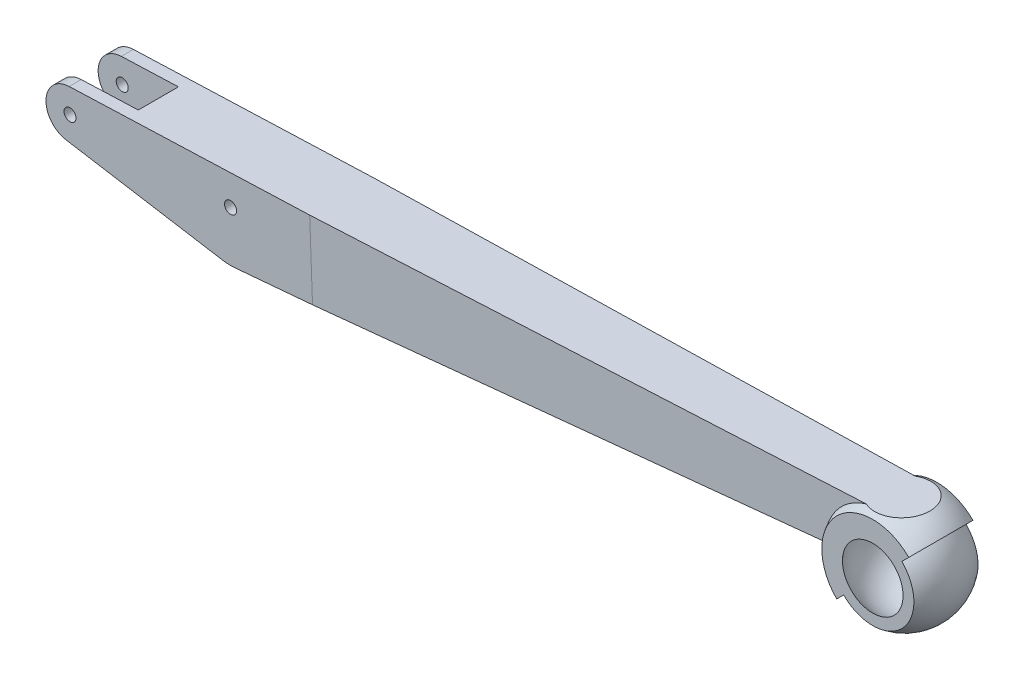
ISO-10303-21;
HEADER;
FILE_DESCRIPTION(('STEP AP214'),'2;1');
FILE_NAME('part.step','',(''),(''),'','','');
FILE_SCHEMA(('AUTOMOTIVE_DESIGN { 1 0 10303 214 1 1 1 1 }'));
ENDSEC;
DATA;
#1=APPLICATION_CONTEXT('core data for automotive mechanical design processes');
#2=APPLICATION_PROTOCOL_DEFINITION('international standard','automotive_design',2000,#1);
#3=PRODUCT_CONTEXT('',#1,'mechanical');
#4=PRODUCT('Part','Part','',(#3));
#5=PRODUCT_RELATED_PRODUCT_CATEGORY('part','',(#4));
#6=PRODUCT_DEFINITION_FORMATION('','',#4);
#7=PRODUCT_DEFINITION_CONTEXT('part definition',#1,'design');
#8=PRODUCT_DEFINITION('design','',#6,#7);
#9=PRODUCT_DEFINITION_SHAPE('','',#8);
#10=(LENGTH_UNIT() NAMED_UNIT(*) SI_UNIT(.MILLI.,.METRE.));
#11=(NAMED_UNIT(*) PLANE_ANGLE_UNIT() SI_UNIT($,.RADIAN.));
#12=(NAMED_UNIT(*) SI_UNIT($,.STERADIAN.) SOLID_ANGLE_UNIT());
#13=UNCERTAINTY_MEASURE_WITH_UNIT(LENGTH_MEASURE(1.E-05),#10,'distance_accuracy_value','');
#14=(GEOMETRIC_REPRESENTATION_CONTEXT(3) GLOBAL_UNCERTAINTY_ASSIGNED_CONTEXT((#13)) GLOBAL_UNIT_ASSIGNED_CONTEXT((#10,
#11,#12)) REPRESENTATION_CONTEXT('',''));
#15=CARTESIAN_POINT('',(0.,0.,0.));
#16=DIRECTION('',(0.,0.,1.));
#17=DIRECTION('',(1.,0.,0.));
#18=AXIS2_PLACEMENT_3D('',#15,#16,#17);
#19=CARTESIAN_POINT('',(0.,0.,-8.));
#20=DIRECTION('',(0.,0.,1.));
#21=DIRECTION('',(-1.,0.,0.));
#22=AXIS2_PLACEMENT_3D('',#19,#20,#21);
#23=CYLINDRICAL_SURFACE('',#22,12.5269384468381);
#24=CARTESIAN_POINT('',(0.,0.,5.));
#25=DIRECTION('',(0.,0.,1.));
#26=DIRECTION('',(1.,0.,0.));
#27=AXIS2_PLACEMENT_3D('',#24,#25,#26);
#28=CIRCLE('',#27,12.5269384468381);
#29=CARTESIAN_POINT('',(-2.04406390424603,-12.3590448500775,5.));
#30=VERTEX_POINT('',#29);
#31=CARTESIAN_POINT('',(1.08223577138531,-12.4801022666484,5.));
#32=VERTEX_POINT('',#31);
#33=EDGE_CURVE('E247',#30,#32,#28,.T.);
#34=ORIENTED_EDGE('',*,*,#33,.T.);
#35=DIRECTION('',(0.,0.,1.));
#36=VECTOR('',#35,1.);
#37=CARTESIAN_POINT('',(1.08223577138531,-12.4801022666484,-8.));
#38=LINE('',#37,#36);
#39=CARTESIAN_POINT('',(1.08223577138531,-12.4801022666484,8.));
#40=VERTEX_POINT('',#39);
#41=EDGE_CURVE('E369',#32,#40,#38,.T.);
#42=ORIENTED_EDGE('',*,*,#41,.T.);
#43=CARTESIAN_POINT('',(0.,0.,8.));
#44=DIRECTION('',(0.,0.,1.));
#45=DIRECTION('',(1.,0.,0.));
#46=AXIS2_PLACEMENT_3D('',#43,#44,#45);
#47=CIRCLE('',#46,12.5269384468381);
#48=CARTESIAN_POINT('',(-2.04406390424603,-12.3590448500775,8.));
#49=VERTEX_POINT('',#48);
#50=EDGE_CURVE('E330',#49,#40,#47,.T.);
#51=ORIENTED_EDGE('',*,*,#50,.F.);
#52=DIRECTION('',(0.,0.,1.));
#53=VECTOR('',#52,1.);
#54=CARTESIAN_POINT('',(-2.04406390424603,-12.3590448500775,-8.));
#55=LINE('',#54,#53);
#56=EDGE_CURVE('E346',#30,#49,#55,.T.);
#57=ORIENTED_EDGE('',*,*,#56,.F.);
#58=EDGE_LOOP('',(#34,#42,#51,#57));
#59=FACE_BOUND('',#58,.T.);
#60=ADVANCED_FACE('F35',(#59),#23,.T.);
#61=CARTESIAN_POINT('',(160.,0.,0.));
#62=DIRECTION('',(-1.,0.,0.));
#63=DIRECTION('',(0.,1.,0.));
#64=AXIS2_PLACEMENT_3D('',#61,#62,#63);
#65=SPHERICAL_SURFACE('',#64,15.);
#66=CARTESIAN_POINT('',(159.505151467158,13.3817007512717,0.));
#67=DIRECTION('',(-0.0369542362489187,0.999316958939084,0.));
#68=DIRECTION('',(0.999316958939084,0.0369542362489187,0.));
#69=AXIS2_PLACEMENT_3D('',#66,#67,#68);
#70=CIRCLE('',#69,6.75908351279662);
#71=CARTESIAN_POINT('',(156.493436870342,13.2703290671133,-6.04999020397985));
#72=VERTEX_POINT('',#71);
#73=CARTESIAN_POINT('',(156.493436870342,13.2703290671133,6.04999020397985));
#74=VERTEX_POINT('',#73);
#75=EDGE_CURVE('E380',#72,#74,#70,.F.);
#76=ORIENTED_EDGE('',*,*,#75,.T.);
#77=CARTESIAN_POINT('',(160.08550336549,0.00316187125628183,6.00583569941776));
#78=DIRECTION('',(0.0142352695206122,0.000526413074676742,0.999898534847887));
#79=DIRECTION('',(0.999898673389219,0.,-0.0142352714929856));
#80=AXIS2_PLACEMENT_3D('',#77,#78,#79);
#81=CIRCLE('',#80,13.744912394361);
#82=CARTESIAN_POINT('',(146.342449375036,0.116413047256877,6.20143200631746));
#83=VERTEX_POINT('',#82);
#84=EDGE_CURVE('E317',#74,#83,#81,.T.);
#85=ORIENTED_EDGE('',*,*,#84,.T.);
#86=CARTESIAN_POINT('',(159.888044575374,1.29104506206708,0.));
#87=DIRECTION('',(0.0863926789437108,-0.996261163061639,0.));
#88=DIRECTION('',(-0.996261163061639,-0.0863926789437108,0.));
#89=AXIS2_PLACEMENT_3D('',#86,#87,#88);
#90=CIRCLE('',#89,14.9439174459246);
#91=CARTESIAN_POINT('',(146.342449375036,0.116413047256878,-6.20143200631746));
#92=VERTEX_POINT('',#91);
#93=EDGE_CURVE('E314',#83,#92,#90,.T.);
#94=ORIENTED_EDGE('',*,*,#93,.T.);
#95=CARTESIAN_POINT('',(160.08550336549,0.00316187125628183,-6.00583569941776));
#96=DIRECTION('',(0.0142352695206122,0.000526413074676742,-0.999898534847887));
#97=DIRECTION('',(-0.999898673389219,0.,-0.0142352714929856));
#98=AXIS2_PLACEMENT_3D('',#95,#96,#97);
#99=CIRCLE('',#98,13.744912394361);
#100=EDGE_CURVE('E377',#92,#72,#99,.T.);
#101=ORIENTED_EDGE('',*,*,#100,.T.);
#102=EDGE_LOOP('',(#76,#85,#94,#101));
#103=FACE_BOUND('',#102,.T.);
#104=CARTESIAN_POINT('',(160.,0.,8.));
#105=DIRECTION('',(0.,0.,1.));
#106=DIRECTION('',(1.,0.,0.));
#107=AXIS2_PLACEMENT_3D('',#104,#105,#106);
#108=CIRCLE('',#107,12.6885775404495);
#109=CARTESIAN_POINT('',(151.027820777537,-8.97217922246309,7.99999999999999));
#110=VERTEX_POINT('',#109);
#111=CARTESIAN_POINT('',(168.972179222463,8.97217922246318,7.99999999999999));
#112=VERTEX_POINT('',#111);
#113=EDGE_CURVE('E299',#110,#112,#108,.F.);
#114=ORIENTED_EDGE('',*,*,#113,.T.);
#115=CARTESIAN_POINT('',(160.,0.,0.));
#116=DIRECTION('',(0.707106781186549,-0.707106781186546,0.));
#117=DIRECTION('',(-0.707106781186546,-0.707106781186549,0.));
#118=AXIS2_PLACEMENT_3D('',#115,#116,#117);
#119=CIRCLE('',#118,15.);
#120=CARTESIAN_POINT('',(168.972179222463,8.97217922246319,-8.));
#121=VERTEX_POINT('',#120);
#122=EDGE_CURVE('E272',#121,#112,#119,.T.);
#123=ORIENTED_EDGE('',*,*,#122,.F.);
#124=CARTESIAN_POINT('',(160.,0.,-8.));
#125=DIRECTION('',(0.,0.,-1.));
#126=DIRECTION('',(-1.,0.,0.));
#127=AXIS2_PLACEMENT_3D('',#124,#125,#126);
#128=CIRCLE('',#127,12.6885775404495);
#129=CARTESIAN_POINT('',(151.027820777537,-8.97217922246309,-7.99999999999999));
#130=VERTEX_POINT('',#129);
#131=EDGE_CURVE('E293',#121,#130,#128,.F.);
#132=ORIENTED_EDGE('',*,*,#131,.T.);
#133=CARTESIAN_POINT('',(160.,0.,0.));
#134=DIRECTION('',(-0.707106781186544,0.707106781186551,0.));
#135=DIRECTION('',(0.707106781186551,0.707106781186544,0.));
#136=AXIS2_PLACEMENT_3D('',#133,#134,#135);
#137=CIRCLE('',#136,15.);
#138=EDGE_CURVE('E281',#130,#110,#137,.T.);
#139=ORIENTED_EDGE('',*,*,#138,.T.);
#140=EDGE_LOOP('',(#114,#123,#132,#139));
#141=FACE_BOUND('',#140,.T.);
#142=ADVANCED_FACE('F456',(#103,#141),#65,.T.);
#143=CARTESIAN_POINT('',(130.,-15.,8.));
#144=DIRECTION('',(0.,0.,-1.));
#145=DIRECTION('',(1.,0.,0.));
#146=AXIS2_PLACEMENT_3D('',#143,#144,#145);
#147=PLANE('',#146);
#148=CARTESIAN_POINT('',(160.,0.,8.));
#149=DIRECTION('',(0.,0.,1.));
#150=DIRECTION('',(1.,0.,0.));
#151=AXIS2_PLACEMENT_3D('',#148,#149,#150);
#152=CIRCLE('',#151,7.54983443527072);
#153=CARTESIAN_POINT('',(165.338539126016,5.33853912601566,8.));
#154=VERTEX_POINT('',#153);
#155=EDGE_CURVE('E266',#154,#154,#152,.F.);
#156=ORIENTED_EDGE('',*,*,#155,.T.);
#157=EDGE_LOOP('',(#156));
#158=FACE_BOUND('',#157,.T.);
#159=DIRECTION('',(0.707106781186552,0.707106781186543,0.));
#160=VECTOR('',#159,1.);
#161=CARTESIAN_POINT('',(151.027820777537,-8.97217922246309,7.99999999999999));
#162=LINE('',#161,#160);
#163=CARTESIAN_POINT('',(152.754311626905,-7.24568837309467,7.99999999999998));
#164=VERTEX_POINT('',#163);
#165=EDGE_CURVE('E284',#110,#164,#162,.T.);
#166=ORIENTED_EDGE('',*,*,#165,.T.);
#167=CARTESIAN_POINT('',(160.,0.,7.99999999999999));
#168=DIRECTION('',(0.,0.,1.));
#169=DIRECTION('',(1.,0.,0.));
#170=AXIS2_PLACEMENT_3D('',#167,#168,#169);
#171=CIRCLE('',#170,10.2469507659596);
#172=CARTESIAN_POINT('',(167.245688373095,7.24568837309475,7.99999999999998));
#173=VERTEX_POINT('',#172);
#174=EDGE_CURVE('E287',#164,#173,#171,.T.);
#175=ORIENTED_EDGE('',*,*,#174,.T.);
#176=DIRECTION('',(-0.707106781186548,-0.707106781186548,0.));
#177=VECTOR('',#176,1.);
#178=CARTESIAN_POINT('',(168.972179222463,8.97217922246318,7.99999999999999));
#179=LINE('',#178,#177);
#180=EDGE_CURVE('E274',#112,#173,#179,.T.);
#181=ORIENTED_EDGE('',*,*,#180,.F.);
#182=ORIENTED_EDGE('',*,*,#113,.F.);
#183=EDGE_LOOP('',(#166,#175,#181,#182));
#184=FACE_BOUND('',#183,.T.);
#185=ADVANCED_FACE('F489',(#158,#184),#147,.F.);
#186=CARTESIAN_POINT('',(130.,-15.,-8.));
#187=DIRECTION('',(0.,0.,1.));
#188=DIRECTION('',(-1.,0.,0.));
#189=AXIS2_PLACEMENT_3D('',#186,#187,#188);
#190=PLANE('',#189);
#191=CARTESIAN_POINT('',(160.,0.,-8.));
#192=DIRECTION('',(0.,0.,-1.));
#193=DIRECTION('',(-1.,0.,0.));
#194=AXIS2_PLACEMENT_3D('',#191,#192,#193);
#195=CIRCLE('',#194,7.54983443527072);
#196=CARTESIAN_POINT('',(165.338539126016,5.33853912601566,-8.));
#197=VERTEX_POINT('',#196);
#198=EDGE_CURVE('E265',#197,#197,#195,.F.);
#199=ORIENTED_EDGE('',*,*,#198,.T.);
#200=EDGE_LOOP('',(#199));
#201=FACE_BOUND('',#200,.T.);
#202=DIRECTION('',(-0.70710678118655,-0.707106781186545,0.));
#203=VECTOR('',#202,1.);
#204=CARTESIAN_POINT('',(151.027820777537,-8.97217922246309,-7.99999999999999));
#205=LINE('',#204,#203);
#206=CARTESIAN_POINT('',(152.754311626905,-7.24568837309466,-7.99999999999999));
#207=VERTEX_POINT('',#206);
#208=EDGE_CURVE('E279',#207,#130,#205,.T.);
#209=ORIENTED_EDGE('',*,*,#208,.T.);
#210=ORIENTED_EDGE('',*,*,#131,.F.);
#211=DIRECTION('',(0.707106781186545,0.70710678118655,0.));
#212=VECTOR('',#211,1.);
#213=CARTESIAN_POINT('',(168.972179222463,8.97217922246318,-7.99999999999999));
#214=LINE('',#213,#212);
#215=CARTESIAN_POINT('',(167.245688373095,7.24568837309474,-7.99999999999999));
#216=VERTEX_POINT('',#215);
#217=EDGE_CURVE('E60',#216,#121,#214,.T.);
#218=ORIENTED_EDGE('',*,*,#217,.F.);
#219=CARTESIAN_POINT('',(160.,0.,-7.99999999999999));
#220=DIRECTION('',(0.,0.,1.));
#221=DIRECTION('',(1.,0.,0.));
#222=AXIS2_PLACEMENT_3D('',#219,#220,#221);
#223=CIRCLE('',#222,10.2469507659596);
#224=EDGE_CURVE('E290',#207,#216,#223,.T.);
#225=ORIENTED_EDGE('',*,*,#224,.F.);
#226=EDGE_LOOP('',(#209,#210,#218,#225));
#227=FACE_BOUND('',#226,.T.);
#228=ADVANCED_FACE('F497',(#201,#227),#190,.F.);
#229=CARTESIAN_POINT('',(-40.,0.,-8.));
#230=DIRECTION('',(0.,0.,1.));
#231=DIRECTION('',(-1.,0.,0.));
#232=AXIS2_PLACEMENT_3D('',#229,#230,#231);
#233=CYLINDRICAL_SURFACE('',#232,6.);
#234=DIRECTION('',(0.,0.,1.));
#235=VECTOR('',#234,1.);
#236=CARTESIAN_POINT('',(-40.9790407670257,-5.91958437531739,-8.));
#237=LINE('',#236,#235);
#238=CARTESIAN_POINT('',(-40.9790407670257,-5.91958437531739,4.99999999999999));
#239=VERTEX_POINT('',#238);
#240=CARTESIAN_POINT('',(-40.9790407670257,-5.91958437531739,8.));
#241=VERTEX_POINT('',#240);
#242=EDGE_CURVE('E361',#239,#241,#237,.T.);
#243=ORIENTED_EDGE('',*,*,#242,.T.);
#244=CARTESIAN_POINT('',(-40.,0.,8.));
#245=DIRECTION('',(0.,0.,1.));
#246=DIRECTION('',(1.,0.,0.));
#247=AXIS2_PLACEMENT_3D('',#244,#245,#246);
#248=CIRCLE('',#247,6.);
#249=CARTESIAN_POINT('',(-40.2217254174935,5.9959017536345,8.));
#250=VERTEX_POINT('',#249);
#251=EDGE_CURVE('E354',#250,#241,#248,.T.);
#252=ORIENTED_EDGE('',*,*,#251,.F.);
#253=DIRECTION('',(0.,0.,1.));
#254=VECTOR('',#253,1.);
#255=CARTESIAN_POINT('',(-40.2217254174935,5.9959017536345,-8.));
#256=LINE('',#255,#254);
#257=CARTESIAN_POINT('',(-40.2217254174935,5.9959017536345,4.99999999999999));
#258=VERTEX_POINT('',#257);
#259=EDGE_CURVE('E365',#258,#250,#256,.T.);
#260=ORIENTED_EDGE('',*,*,#259,.F.);
#261=CARTESIAN_POINT('',(-40.,0.,4.99999999999999));
#262=DIRECTION('',(0.,0.,-1.));
#263=DIRECTION('',(-1.,0.,0.));
#264=AXIS2_PLACEMENT_3D('',#261,#262,#263);
#265=CIRCLE('',#264,6.);
#266=EDGE_CURVE('E308',#239,#258,#265,.T.);
#267=ORIENTED_EDGE('',*,*,#266,.F.);
#268=EDGE_LOOP('',(#243,#252,#260,#267));
#269=FACE_BOUND('',#268,.T.);
#270=ADVANCED_FACE('F433',(#269),#233,.T.);
#271=CARTESIAN_POINT('',(-2.04406390424603,-12.3590448500775,-8.));
#272=VERTEX_POINT('',#271);
#273=CARTESIAN_POINT('',(-2.04406390424603,-12.3590448500775,-5.));
#274=VERTEX_POINT('',#273);
#275=EDGE_CURVE('E358',#272,#274,#55,.T.);
#276=ORIENTED_EDGE('',*,*,#275,.F.);
#277=CARTESIAN_POINT('',(0.,0.,-8.));
#278=DIRECTION('',(0.,0.,1.));
#279=DIRECTION('',(1.,0.,0.));
#280=AXIS2_PLACEMENT_3D('',#277,#278,#279);
#281=CIRCLE('',#280,12.5269384468381);
#282=CARTESIAN_POINT('',(1.08223577138531,-12.4801022666484,-8.));
#283=VERTEX_POINT('',#282);
#284=EDGE_CURVE('E331',#272,#283,#281,.T.);
#285=ORIENTED_EDGE('',*,*,#284,.T.);
#286=CARTESIAN_POINT('',(1.08223577138531,-12.4801022666484,-5.));
#287=VERTEX_POINT('',#286);
#288=EDGE_CURVE('E370',#283,#287,#38,.T.);
#289=ORIENTED_EDGE('',*,*,#288,.T.);
#290=CARTESIAN_POINT('',(0.,0.,-5.));
#291=DIRECTION('',(0.,0.,1.));
#292=DIRECTION('',(1.,0.,0.));
#293=AXIS2_PLACEMENT_3D('',#290,#291,#292);
#294=CIRCLE('',#293,12.5269384468381);
#295=EDGE_CURVE('E241',#274,#287,#294,.T.);
#296=ORIENTED_EDGE('',*,*,#295,.F.);
#297=EDGE_LOOP('',(#276,#285,#289,#296));
#298=FACE_BOUND('',#297,.T.);
#299=ADVANCED_FACE('F37',(#298),#23,.T.);
#300=CARTESIAN_POINT('',(145.,0.,-8.));
#301=DIRECTION('',(-0.0863926789437108,0.996261163061639,0.));
#302=DIRECTION('',(-0.996261163061639,-0.0863926789437108,0.));
#303=AXIS2_PLACEMENT_3D('',#300,#301,#302);
#304=PLANE('',#303);
#305=ORIENTED_EDGE('',*,*,#288,.F.);
#306=DIRECTION('',(0.996261163061639,0.0863926789437108,0.));
#307=VECTOR('',#306,1.);
#308=CARTESIAN_POINT('',(1.08223577138531,-12.4801022666484,-8.));
#309=LINE('',#308,#307);
#310=CARTESIAN_POINT('',(20.4131885576658,-10.8037819807017,-8.));
#311=VERTEX_POINT('',#310);
#312=EDGE_CURVE('E334',#283,#311,#309,.T.);
#313=ORIENTED_EDGE('',*,*,#312,.T.);
#314=DIRECTION('',(-0.996160325095163,-0.0863839345879274,-0.0142275279443665));
#315=VECTOR('',#314,1.);
#316=CARTESIAN_POINT('',(144.974780819756,-0.00218692911338649,-6.22096555136907));
#317=LINE('',#316,#315);
#318=EDGE_CURVE('E322',#92,#311,#317,.T.);
#319=ORIENTED_EDGE('',*,*,#318,.F.);
#320=ORIENTED_EDGE('',*,*,#93,.F.);
#321=DIRECTION('',(0.996160325095163,0.0863839345879274,-0.0142275279443665));
#322=VECTOR('',#321,1.);
#323=CARTESIAN_POINT('',(145.201547201554,0.0174775483793186,6.21772679054655));
#324=LINE('',#323,#322);
#325=CARTESIAN_POINT('',(20.4131885576658,-10.8037819807017,8.));
#326=VERTEX_POINT('',#325);
#327=EDGE_CURVE('E328',#326,#83,#324,.T.);
#328=ORIENTED_EDGE('',*,*,#327,.F.);
#329=DIRECTION('',(0.996261163061639,0.0863926789437108,0.));
#330=VECTOR('',#329,1.);
#331=CARTESIAN_POINT('',(145.,0.,8.));
#332=LINE('',#331,#330);
#333=EDGE_CURVE('E349',#40,#326,#332,.T.);
#334=ORIENTED_EDGE('',*,*,#333,.F.);
#335=ORIENTED_EDGE('',*,*,#41,.F.);
#336=DIRECTION('',(0.996261163061639,0.0863926789437108,0.));
#337=VECTOR('',#336,1.);
#338=CARTESIAN_POINT('',(145.,0.,5.));
#339=LINE('',#338,#337);
#340=CARTESIAN_POINT('',(20.3918737201203,-10.8056303373225,5.));
#341=VERTEX_POINT('',#340);
#342=EDGE_CURVE('E238',#32,#341,#339,.T.);
#343=ORIENTED_EDGE('',*,*,#342,.T.);
#344=DIRECTION('',(0.996160325095163,0.0863839345879274,-0.0142275279443665));
#345=VECTOR('',#344,1.);
#346=CARTESIAN_POINT('',(145.159024190363,0.0137900847003733,3.21802969347853));
#347=LINE('',#346,#345);
#348=CARTESIAN_POINT('',(143.313103636008,-0.146282422108912,3.24439380938292));
#349=VERTEX_POINT('',#348);
#350=EDGE_CURVE('E234',#341,#349,#347,.T.);
#351=ORIENTED_EDGE('',*,*,#350,.T.);
#352=CARTESIAN_POINT('',(159.888044575374,1.29104506206708,0.));
#353=DIRECTION('',(0.0863926789437108,-0.996261163061639,0.));
#354=DIRECTION('',(-0.996261163061639,-0.0863926789437108,0.));
#355=AXIS2_PLACEMENT_3D('',#352,#353,#354);
#356=CIRCLE('',#355,16.9505359393327);
#357=CARTESIAN_POINT('',(143.313103636008,-0.146282422108911,-3.24439380938292));
#358=VERTEX_POINT('',#357);
#359=EDGE_CURVE('E262',#349,#358,#356,.T.);
#360=ORIENTED_EDGE('',*,*,#359,.T.);
#361=DIRECTION('',(-0.996160325095163,-0.0863839345879274,-0.0142275279443665));
#362=VECTOR('',#361,1.);
#363=CARTESIAN_POINT('',(144.932257808565,-0.00587439279233178,-3.22126845430105));
#364=LINE('',#363,#362);
#365=CARTESIAN_POINT('',(20.3918737201203,-10.8056303373225,-5.));
#366=VERTEX_POINT('',#365);
#367=EDGE_CURVE('E225',#358,#366,#364,.T.);
#368=ORIENTED_EDGE('',*,*,#367,.T.);
#369=DIRECTION('',(0.996261163061639,0.0863926789437108,0.));
#370=VECTOR('',#369,1.);
#371=CARTESIAN_POINT('',(145.,0.,-5.));
#372=LINE('',#371,#370);
#373=EDGE_CURVE('E205',#287,#366,#372,.T.);
#374=ORIENTED_EDGE('',*,*,#373,.F.);
#375=EDGE_LOOP('',(#305,#313,#319,#320,#328,#334,#335,#343,#351,#360,#368,#374));
#376=FACE_BOUND('',#375,.T.);
#377=ADVANCED_FACE('F449',(#376),#304,.F.);
#378=CARTESIAN_POINT('',(-40.2217254174935,5.9959017536345,-8.));
#379=DIRECTION('',(0.0369542362489186,-0.999316958939084,0.));
#380=DIRECTION('',(0.999316958939084,0.0369542362489187,0.));
#381=AXIS2_PLACEMENT_3D('',#378,#379,#380);
#382=PLANE('',#381);
#383=ORIENTED_EDGE('',*,*,#259,.T.);
#384=DIRECTION('',(-0.999316958939084,-0.0369542362489186,0.));
#385=VECTOR('',#384,1.);
#386=CARTESIAN_POINT('',(-40.2217254174935,5.9959017536345,8.));
#387=LINE('',#386,#385);
#388=CARTESIAN_POINT('',(19.7099891382185,8.21214627814031,8.));
#389=VERTEX_POINT('',#388);
#390=EDGE_CURVE('E352',#389,#250,#387,.T.);
#391=ORIENTED_EDGE('',*,*,#390,.F.);
#392=DIRECTION('',(-0.999215563091836,-0.0369504866817164,0.0142449994401426));
#393=VECTOR('',#392,1.);
#394=CARTESIAN_POINT('',(-39.9818228712443,6.00477322858698,8.85097736671036));
#395=LINE('',#394,#393);
#396=EDGE_CURVE('E325',#74,#389,#395,.T.);
#397=ORIENTED_EDGE('',*,*,#396,.F.);
#398=ORIENTED_EDGE('',*,*,#75,.F.);
#399=DIRECTION('',(0.999215563091836,0.0369504866817164,0.0142449994401426));
#400=VECTOR('',#399,1.);
#401=CARTESIAN_POINT('',(-40.2095640734335,5.99635147399347,-8.85422408685515));
#402=LINE('',#401,#400);
#403=CARTESIAN_POINT('',(19.7099891382185,8.21214627814031,-8.));
#404=VERTEX_POINT('',#403);
#405=EDGE_CURVE('E320',#404,#72,#402,.T.);
#406=ORIENTED_EDGE('',*,*,#405,.F.);
#407=DIRECTION('',(-0.999316958939084,-0.0369542362489186,0.));
#408=VECTOR('',#407,1.);
#409=CARTESIAN_POINT('',(147.077854414978,12.9221455850216,-8.));
#410=LINE('',#409,#408);
#411=CARTESIAN_POINT('',(-40.2217254174935,5.9959017536345,-8.));
#412=VERTEX_POINT('',#411);
#413=EDGE_CURVE('E338',#404,#412,#410,.T.);
#414=ORIENTED_EDGE('',*,*,#413,.T.);
#415=CARTESIAN_POINT('',(-40.2217254174935,5.9959017536345,-5.));
#416=VERTEX_POINT('',#415);
#417=EDGE_CURVE('E366',#412,#416,#256,.T.);
#418=ORIENTED_EDGE('',*,*,#417,.T.);
#419=DIRECTION('',(-0.999316958939084,-0.0369542362489187,0.));
#420=VECTOR('',#419,1.);
#421=CARTESIAN_POINT('',(-40.2217254174935,5.9959017536345,-5.));
#422=LINE('',#421,#420);
#423=CARTESIAN_POINT('',(-26.,6.5218139742209,-5.));
#424=VERTEX_POINT('',#423);
#425=EDGE_CURVE('E302',#424,#416,#422,.T.);
#426=ORIENTED_EDGE('',*,*,#425,.F.);
#427=DIRECTION('',(0.,0.,-1.));
#428=VECTOR('',#427,1.);
#429=CARTESIAN_POINT('',(-26.,6.52181397422091,-8.));
#430=LINE('',#429,#428);
#431=CARTESIAN_POINT('',(-26.,6.52181397422091,4.99999999999999));
#432=VERTEX_POINT('',#431);
#433=EDGE_CURVE('E305',#432,#424,#430,.T.);
#434=ORIENTED_EDGE('',*,*,#433,.F.);
#435=DIRECTION('',(0.999316958939084,0.0369542362489187,0.));
#436=VECTOR('',#435,1.);
#437=CARTESIAN_POINT('',(-40.2217254174935,5.9959017536345,4.99999999999999));
#438=LINE('',#437,#436);
#439=EDGE_CURVE('E311',#258,#432,#438,.T.);
#440=ORIENTED_EDGE('',*,*,#439,.F.);
#441=EDGE_LOOP('',(#383,#391,#397,#398,#406,#414,#418,#426,#434,#440));
#442=FACE_BOUND('',#441,.T.);
#443=ADVANCED_FACE('F429',(#442),#382,.F.);
#444=ORIENTED_EDGE('',*,*,#417,.F.);
#445=CARTESIAN_POINT('',(-40.,0.,-8.));
#446=DIRECTION('',(0.,0.,1.));
#447=DIRECTION('',(1.,0.,0.));
#448=AXIS2_PLACEMENT_3D('',#445,#446,#447);
#449=CIRCLE('',#448,6.);
#450=CARTESIAN_POINT('',(-40.9790407670257,-5.91958437531739,-8.));
#451=VERTEX_POINT('',#450);
#452=EDGE_CURVE('E341',#412,#451,#449,.T.);
#453=ORIENTED_EDGE('',*,*,#452,.T.);
#454=CARTESIAN_POINT('',(-40.9790407670257,-5.91958437531739,-5.));
#455=VERTEX_POINT('',#454);
#456=EDGE_CURVE('E362',#451,#455,#237,.T.);
#457=ORIENTED_EDGE('',*,*,#456,.T.);
#458=CARTESIAN_POINT('',(-40.,0.,-5.));
#459=DIRECTION('',(0.,0.,1.));
#460=DIRECTION('',(1.,0.,0.));
#461=AXIS2_PLACEMENT_3D('',#458,#459,#460);
#462=CIRCLE('',#461,6.);
#463=EDGE_CURVE('E296',#416,#455,#462,.T.);
#464=ORIENTED_EDGE('',*,*,#463,.F.);
#465=EDGE_LOOP('',(#444,#453,#457,#464));
#466=FACE_BOUND('',#465,.T.);
#467=ADVANCED_FACE('F466',(#466),#233,.T.);
#468=CARTESIAN_POINT('',(-40.9790407670257,-5.91958437531739,-8.));
#469=DIRECTION('',(0.163173461170952,0.986597395886231,0.));
#470=DIRECTION('',(-0.986597395886231,0.163173461170952,0.));
#471=AXIS2_PLACEMENT_3D('',#468,#469,#470);
#472=PLANE('',#471);
#473=DIRECTION('',(0.,0.,1.));
#474=VECTOR('',#473,1.);
#475=CARTESIAN_POINT('',(-23.,-8.89314007566866,-8.));
#476=LINE('',#475,#474);
#477=CARTESIAN_POINT('',(-23.,-8.89314007566866,-5.));
#478=VERTEX_POINT('',#477);
#479=CARTESIAN_POINT('',(-23.,-8.89314007566866,5.));
#480=VERTEX_POINT('',#479);
#481=EDGE_CURVE('E210',#478,#480,#476,.T.);
#482=ORIENTED_EDGE('',*,*,#481,.T.);
#483=DIRECTION('',(0.986597395886231,-0.163173461170952,0.));
#484=VECTOR('',#483,1.);
#485=CARTESIAN_POINT('',(-40.9790407670257,-5.91958437531739,5.));
#486=LINE('',#485,#484);
#487=EDGE_CURVE('E237',#480,#30,#486,.T.);
#488=ORIENTED_EDGE('',*,*,#487,.T.);
#489=ORIENTED_EDGE('',*,*,#56,.T.);
#490=DIRECTION('',(0.986597395886231,-0.163173461170952,0.));
#491=VECTOR('',#490,1.);
#492=CARTESIAN_POINT('',(-40.9790407670257,-5.91958437531739,8.));
#493=LINE('',#492,#491);
#494=EDGE_CURVE('E335',#241,#49,#493,.T.);
#495=ORIENTED_EDGE('',*,*,#494,.F.);
#496=ORIENTED_EDGE('',*,*,#242,.F.);
#497=DIRECTION('',(-0.986597395886231,0.163173461170952,0.));
#498=VECTOR('',#497,1.);
#499=CARTESIAN_POINT('',(-40.9790407670257,-5.91958437531739,4.99999999999999));
#500=LINE('',#499,#498);
#501=CARTESIAN_POINT('',(-26.,-8.39696971726919,4.99999999999999));
#502=VERTEX_POINT('',#501);
#503=EDGE_CURVE('E11',#502,#239,#500,.T.);
#504=ORIENTED_EDGE('',*,*,#503,.F.);
#505=DIRECTION('',(0.,0.,1.));
#506=VECTOR('',#505,1.);
#507=CARTESIAN_POINT('',(-26.,-8.39696971726919,-8.));
#508=LINE('',#507,#506);
#509=CARTESIAN_POINT('',(-26.,-8.39696971726919,-5.));
#510=VERTEX_POINT('',#509);
#511=EDGE_CURVE('E44',#510,#502,#508,.T.);
#512=ORIENTED_EDGE('',*,*,#511,.F.);
#513=DIRECTION('',(0.986597395886231,-0.163173461170952,0.));
#514=VECTOR('',#513,1.);
#515=CARTESIAN_POINT('',(-40.9790407670257,-5.91958437531739,-5.));
#516=LINE('',#515,#514);
#517=EDGE_CURVE('E383',#455,#510,#516,.T.);
#518=ORIENTED_EDGE('',*,*,#517,.F.);
#519=ORIENTED_EDGE('',*,*,#456,.F.);
#520=DIRECTION('',(0.986597395886231,-0.163173461170952,0.));
#521=VECTOR('',#520,1.);
#522=CARTESIAN_POINT('',(-40.9790407670257,-5.91958437531739,-8.));
#523=LINE('',#522,#521);
#524=EDGE_CURVE('E344',#451,#272,#523,.T.);
#525=ORIENTED_EDGE('',*,*,#524,.T.);
#526=ORIENTED_EDGE('',*,*,#275,.T.);
#527=DIRECTION('',(0.986597395886231,-0.163173461170952,0.));
#528=VECTOR('',#527,1.);
#529=CARTESIAN_POINT('',(-40.9790407670257,-5.91958437531739,-5.));
#530=LINE('',#529,#528);
#531=EDGE_CURVE('E220',#478,#274,#530,.T.);
#532=ORIENTED_EDGE('',*,*,#531,.F.);
#533=EDGE_LOOP('',(#482,#488,#489,#495,#496,#504,#512,#518,#519,#525,#526,#532));
#534=FACE_BOUND('',#533,.T.);
#535=ADVANCED_FACE('F437',(#534),#472,.F.);
#536=CARTESIAN_POINT('',(0.,0.,-8.));
#537=DIRECTION('',(0.,0.,-1.));
#538=DIRECTION('',(1.,0.,0.));
#539=AXIS2_PLACEMENT_3D('',#536,#537,#538);
#540=PLANE('',#539);
#541=CARTESIAN_POINT('',(0.,0.,-8.));
#542=DIRECTION('',(0.,0.,-1.));
#543=DIRECTION('',(-1.,0.,0.));
#544=AXIS2_PLACEMENT_3D('',#541,#542,#543);
#545=CIRCLE('',#544,1.5);
#546=CARTESIAN_POINT('',(-1.5,0.,-8.));
#547=VERTEX_POINT('',#546);
#548=EDGE_CURVE('E767',#547,#547,#545,.T.);
#549=ORIENTED_EDGE('',*,*,#548,.F.);
#550=EDGE_LOOP('',(#549));
#551=FACE_BOUND('',#550,.T.);
#552=CARTESIAN_POINT('',(-40.,0.,-8.));
#553=DIRECTION('',(0.,0.,-1.));
#554=DIRECTION('',(-1.,0.,0.));
#555=AXIS2_PLACEMENT_3D('',#552,#553,#554);
#556=CIRCLE('',#555,1.5);
#557=CARTESIAN_POINT('',(-41.5,0.,-8.));
#558=VERTEX_POINT('',#557);
#559=EDGE_CURVE('E396',#558,#558,#556,.T.);
#560=ORIENTED_EDGE('',*,*,#559,.F.);
#561=EDGE_LOOP('',(#560));
#562=FACE_BOUND('',#561,.T.);
#563=DIRECTION('',(0.0369542362489187,-0.999316958939084,0.));
#564=VECTOR('',#563,1.);
#565=CARTESIAN_POINT('',(19.9863391787817,0.739084724978373,-8.));
#566=LINE('',#565,#564);
#567=EDGE_CURVE('E375',#404,#311,#566,.T.);
#568=ORIENTED_EDGE('',*,*,#567,.T.);
#569=ORIENTED_EDGE('',*,*,#312,.F.);
#570=ORIENTED_EDGE('',*,*,#284,.F.);
#571=ORIENTED_EDGE('',*,*,#524,.F.);
#572=ORIENTED_EDGE('',*,*,#452,.F.);
#573=ORIENTED_EDGE('',*,*,#413,.F.);
#574=EDGE_LOOP('',(#568,#569,#570,#571,#572,#573));
#575=FACE_BOUND('',#574,.T.);
#576=ADVANCED_FACE('F420',(#551,#562,#575),#540,.T.);
#577=CARTESIAN_POINT('',(0.,0.,8.));
#578=DIRECTION('',(0.,0.,-1.));
#579=DIRECTION('',(1.,0.,0.));
#580=AXIS2_PLACEMENT_3D('',#577,#578,#579);
#581=PLANE('',#580);
#582=CARTESIAN_POINT('',(0.,0.,8.));
#583=DIRECTION('',(0.,0.,1.));
#584=DIRECTION('',(1.,0.,0.));
#585=AXIS2_PLACEMENT_3D('',#582,#583,#584);
#586=CIRCLE('',#585,1.5);
#587=CARTESIAN_POINT('',(1.5,0.,8.));
#588=VERTEX_POINT('',#587);
#589=EDGE_CURVE('E402',#588,#588,#586,.T.);
#590=ORIENTED_EDGE('',*,*,#589,.F.);
#591=EDGE_LOOP('',(#590));
#592=FACE_BOUND('',#591,.T.);
#593=CARTESIAN_POINT('',(-40.,0.,8.));
#594=DIRECTION('',(0.,0.,1.));
#595=DIRECTION('',(1.,0.,0.));
#596=AXIS2_PLACEMENT_3D('',#593,#594,#595);
#597=CIRCLE('',#596,1.5);
#598=CARTESIAN_POINT('',(-38.5,0.,8.));
#599=VERTEX_POINT('',#598);
#600=EDGE_CURVE('E229',#599,#599,#597,.T.);
#601=ORIENTED_EDGE('',*,*,#600,.F.);
#602=EDGE_LOOP('',(#601));
#603=FACE_BOUND('',#602,.T.);
#604=ORIENTED_EDGE('',*,*,#390,.T.);
#605=ORIENTED_EDGE('',*,*,#251,.T.);
#606=ORIENTED_EDGE('',*,*,#494,.T.);
#607=ORIENTED_EDGE('',*,*,#50,.T.);
#608=ORIENTED_EDGE('',*,*,#333,.T.);
#609=DIRECTION('',(0.0369542362489187,-0.999316958939084,0.));
#610=VECTOR('',#609,1.);
#611=CARTESIAN_POINT('',(19.9863391787817,0.739084724978373,8.));
#612=LINE('',#611,#610);
#613=EDGE_CURVE('E373',#389,#326,#612,.T.);
#614=ORIENTED_EDGE('',*,*,#613,.F.);
#615=EDGE_LOOP('',(#604,#605,#606,#607,#608,#614));
#616=FACE_BOUND('',#615,.T.);
#617=ADVANCED_FACE('F416',(#592,#603,#616),#581,.F.);
#618=CARTESIAN_POINT('',(20.6693899111684,-17.7319824645047,8.));
#619=DIRECTION('',(-0.0142352695206122,-0.000526413074676742,-0.999898534847887));
#620=DIRECTION('',(0.999898673389219,0.,-0.0142352714929856));
#621=AXIS2_PLACEMENT_3D('',#618,#619,#620);
#622=PLANE('',#621);
#623=ORIENTED_EDGE('',*,*,#396,.T.);
#624=ORIENTED_EDGE('',*,*,#613,.T.);
#625=ORIENTED_EDGE('',*,*,#327,.T.);
#626=ORIENTED_EDGE('',*,*,#84,.F.);
#627=EDGE_LOOP('',(#623,#624,#625,#626));
#628=FACE_BOUND('',#627,.T.);
#629=ADVANCED_FACE('F419',(#628),#622,.F.);
#630=CARTESIAN_POINT('',(20.6693899111684,-17.7319824645047,-8.));
#631=DIRECTION('',(-0.0142352695206122,-0.000526413074676742,0.999898534847887));
#632=DIRECTION('',(-0.999898673389219,0.,-0.0142352714929856));
#633=AXIS2_PLACEMENT_3D('',#630,#631,#632);
#634=PLANE('',#633);
#635=ORIENTED_EDGE('',*,*,#318,.T.);
#636=ORIENTED_EDGE('',*,*,#567,.F.);
#637=ORIENTED_EDGE('',*,*,#405,.T.);
#638=ORIENTED_EDGE('',*,*,#100,.F.);
#639=EDGE_LOOP('',(#635,#636,#637,#638));
#640=FACE_BOUND('',#639,.T.);
#641=ADVANCED_FACE('F460',(#640),#634,.F.);
#642=CARTESIAN_POINT('',(-86.,-15.,4.99999999999999));
#643=DIRECTION('',(0.,0.,1.));
#644=DIRECTION('',(-1.,0.,0.));
#645=AXIS2_PLACEMENT_3D('',#642,#643,#644);
#646=PLANE('',#645);
#647=CARTESIAN_POINT('',(-40.,0.,4.99999999999999));
#648=DIRECTION('',(0.,0.,-1.));
#649=DIRECTION('',(-1.,0.,0.));
#650=AXIS2_PLACEMENT_3D('',#647,#648,#649);
#651=CIRCLE('',#650,1.5);
#652=CARTESIAN_POINT('',(-41.5,0.,4.99999999999999));
#653=VERTEX_POINT('',#652);
#654=EDGE_CURVE('E395',#653,#653,#651,.T.);
#655=ORIENTED_EDGE('',*,*,#654,.F.);
#656=EDGE_LOOP('',(#655));
#657=FACE_BOUND('',#656,.T.);
#658=ORIENTED_EDGE('',*,*,#266,.T.);
#659=ORIENTED_EDGE('',*,*,#439,.T.);
#660=DIRECTION('',(0.,1.,0.));
#661=VECTOR('',#660,1.);
#662=CARTESIAN_POINT('',(-26.,-15.,4.99999999999999));
#663=LINE('',#662,#661);
#664=EDGE_CURVE('E294',#502,#432,#663,.T.);
#665=ORIENTED_EDGE('',*,*,#664,.F.);
#666=ORIENTED_EDGE('',*,*,#503,.T.);
#667=EDGE_LOOP('',(#658,#659,#665,#666));
#668=FACE_BOUND('',#667,.T.);
#669=ADVANCED_FACE('F473',(#657,#668),#646,.F.);
#670=CARTESIAN_POINT('',(-26.,-15.,4.99999999999999));
#671=DIRECTION('',(1.,0.,0.));
#672=DIRECTION('',(0.,0.,1.));
#673=AXIS2_PLACEMENT_3D('',#670,#671,#672);
#674=PLANE('',#673);
#675=ORIENTED_EDGE('',*,*,#664,.T.);
#676=ORIENTED_EDGE('',*,*,#433,.T.);
#677=DIRECTION('',(0.,1.,0.));
#678=VECTOR('',#677,1.);
#679=CARTESIAN_POINT('',(-26.,-15.,-5.));
#680=LINE('',#679,#678);
#681=EDGE_CURVE('E297',#510,#424,#680,.T.);
#682=ORIENTED_EDGE('',*,*,#681,.F.);
#683=ORIENTED_EDGE('',*,*,#511,.T.);
#684=EDGE_LOOP('',(#675,#676,#682,#683));
#685=FACE_BOUND('',#684,.T.);
#686=ADVANCED_FACE('F471',(#685),#674,.F.);
#687=CARTESIAN_POINT('',(-86.,-15.,-5.00000000000001));
#688=DIRECTION('',(0.,0.,-1.));
#689=DIRECTION('',(1.,0.,0.));
#690=AXIS2_PLACEMENT_3D('',#687,#688,#689);
#691=PLANE('',#690);
#692=CARTESIAN_POINT('',(-40.,0.,-5.));
#693=DIRECTION('',(0.,0.,1.));
#694=DIRECTION('',(1.,0.,0.));
#695=AXIS2_PLACEMENT_3D('',#692,#693,#694);
#696=CIRCLE('',#695,1.5);
#697=CARTESIAN_POINT('',(-38.5,0.,-5.));
#698=VERTEX_POINT('',#697);
#699=EDGE_CURVE('E393',#698,#698,#696,.T.);
#700=ORIENTED_EDGE('',*,*,#699,.F.);
#701=EDGE_LOOP('',(#700));
#702=FACE_BOUND('',#701,.T.);
#703=ORIENTED_EDGE('',*,*,#681,.T.);
#704=ORIENTED_EDGE('',*,*,#425,.T.);
#705=ORIENTED_EDGE('',*,*,#463,.T.);
#706=ORIENTED_EDGE('',*,*,#517,.T.);
#707=EDGE_LOOP('',(#703,#704,#705,#706));
#708=FACE_BOUND('',#707,.T.);
#709=ADVANCED_FACE('F469',(#702,#708),#691,.F.);
#710=CARTESIAN_POINT('',(160.,0.,0.));
#711=DIRECTION('',(0.,0.,-1.));
#712=DIRECTION('',(-0.707106781186551,-0.707106781186544,0.));
#713=AXIS2_PLACEMENT_3D('',#710,#711,#712);
#714=SPHERICAL_SURFACE('',#713,13.);
#715=ORIENTED_EDGE('',*,*,#224,.T.);
#716=CARTESIAN_POINT('',(160.,0.,0.));
#717=DIRECTION('',(-0.707106781186549,0.707106781186546,0.));
#718=DIRECTION('',(-0.707106781186546,-0.707106781186549,0.));
#719=AXIS2_PLACEMENT_3D('',#716,#717,#718);
#720=CIRCLE('',#719,13.);
#721=EDGE_CURVE('E269',#173,#216,#720,.T.);
#722=ORIENTED_EDGE('',*,*,#721,.F.);
#723=ORIENTED_EDGE('',*,*,#174,.F.);
#724=CARTESIAN_POINT('',(160.,0.,0.));
#725=DIRECTION('',(0.707106781186544,-0.707106781186551,0.));
#726=DIRECTION('',(0.707106781186551,0.707106781186544,0.));
#727=AXIS2_PLACEMENT_3D('',#724,#725,#726);
#728=CIRCLE('',#727,13.);
#729=EDGE_CURVE('E277',#164,#207,#728,.T.);
#730=ORIENTED_EDGE('',*,*,#729,.T.);
#731=EDGE_LOOP('',(#715,#722,#723,#730));
#732=FACE_BOUND('',#731,.T.);
#733=ADVANCED_FACE('F535',(#732),#714,.T.);
#734=CARTESIAN_POINT('',(160.,0.,0.));
#735=DIRECTION('',(0.707106781186544,-0.707106781186551,0.));
#736=DIRECTION('',(0.707106781186551,0.707106781186544,0.));
#737=AXIS2_PLACEMENT_3D('',#734,#735,#736);
#738=PLANE('',#737);
#739=ORIENTED_EDGE('',*,*,#729,.F.);
#740=ORIENTED_EDGE('',*,*,#165,.F.);
#741=ORIENTED_EDGE('',*,*,#138,.F.);
#742=ORIENTED_EDGE('',*,*,#208,.F.);
#743=EDGE_LOOP('',(#739,#740,#741,#742));
#744=FACE_BOUND('',#743,.T.);
#745=ADVANCED_FACE('F532',(#744),#738,.T.);
#746=CARTESIAN_POINT('',(160.,0.,0.));
#747=DIRECTION('',(-0.707106781186549,0.707106781186546,0.));
#748=DIRECTION('',(-0.707106781186546,-0.707106781186549,0.));
#749=AXIS2_PLACEMENT_3D('',#746,#747,#748);
#750=PLANE('',#749);
#751=ORIENTED_EDGE('',*,*,#721,.T.);
#752=ORIENTED_EDGE('',*,*,#217,.T.);
#753=ORIENTED_EDGE('',*,*,#122,.T.);
#754=ORIENTED_EDGE('',*,*,#180,.T.);
#755=EDGE_LOOP('',(#751,#752,#753,#754));
#756=FACE_BOUND('',#755,.T.);
#757=ADVANCED_FACE('F528',(#756),#750,.F.);
#758=CARTESIAN_POINT('',(160.,0.,0.));
#759=DIRECTION('',(0.,0.,1.));
#760=DIRECTION('',(0.707106781186546,0.707106781186549,0.));
#761=AXIS2_PLACEMENT_3D('',#758,#759,#760);
#762=SPHERICAL_SURFACE('',#761,11.);
#763=CARTESIAN_POINT('',(165.338539126016,5.33853912601566,-8.));
#764=CARTESIAN_POINT('',(165.434512261914,5.43451226191369,-7.87191698154592));
#765=CARTESIAN_POINT('',(165.52817614099,5.5281761409895,-7.74037402280926));
#766=CARTESIAN_POINT('',(165.710652717198,5.710652717198,-7.47072231482347));
#767=CARTESIAN_POINT('',(165.799465414331,5.79946541433069,-7.33261356557435));
#768=CARTESIAN_POINT('',(165.972006958354,5.97200695835428,-7.05018436661637));
#769=CARTESIAN_POINT('',(166.055735805245,6.05573580524518,-6.90586391690751));
#770=CARTESIAN_POINT('',(166.217893513485,6.21789351348485,-6.6113860509233));
#771=CARTESIAN_POINT('',(166.296322374834,6.29632237483361,-6.46122863464794));
#772=CARTESIAN_POINT('',(166.447676800906,6.44767680090637,-6.15546546553053));
#773=CARTESIAN_POINT('',(166.52060236563,6.52060236563038,-5.99985971268848));
#774=CARTESIAN_POINT('',(166.66076138189,6.66076138189032,-5.68360293804546));
#775=CARTESIAN_POINT('',(166.727994833426,6.72799483342626,-5.52295191624449));
#776=CARTESIAN_POINT('',(166.856595483809,6.85659548380863,-5.19702065022121));
#777=CARTESIAN_POINT('',(166.917962682655,6.91796268265505,-5.03174040599891));
#778=CARTESIAN_POINT('',(167.034671898335,7.03467189833499,-4.69697875423604));
#779=CARTESIAN_POINT('',(167.090013915168,7.0900139151685,-4.52749734669548));
#780=CARTESIAN_POINT('',(167.19452943728,7.19452943727994,-4.18477230156745));
#781=CARTESIAN_POINT('',(167.243702942558,7.24370294255788,-4.01152866397998));
#782=CARTESIAN_POINT('',(167.335754088897,7.33575408889678,-3.66172783739779));
#783=CARTESIAN_POINT('',(167.378631729958,7.37863172995774,-3.48517064840307));
#784=CARTESIAN_POINT('',(167.457980100329,7.45798010032943,-3.12919997885747));
#785=CARTESIAN_POINT('',(167.49445082964,7.49445082964016,-2.94978649830658));
#786=CARTESIAN_POINT('',(167.560890922128,7.56089092212813,-2.58856790304103));
#787=CARTESIAN_POINT('',(167.590860285305,7.59086028530536,-2.40676278832636));
#788=CARTESIAN_POINT('',(167.644220028804,7.64422002880408,-2.04123177611177));
#789=CARTESIAN_POINT('',(167.667610409126,7.66761040912557,-1.85750587861186));
#790=CARTESIAN_POINT('',(167.707751608899,7.70775160889909,-1.48860912678932));
#791=CARTESIAN_POINT('',(167.724502428351,7.72450242835112,-1.30343827246669));
#792=CARTESIAN_POINT('',(167.751321123961,7.7513211239615,-0.932131175207465));
#793=CARTESIAN_POINT('',(167.76138900012,7.76138900011985,-0.745994932270864));
#794=CARTESIAN_POINT('',(167.774815734665,7.77481573466512,-0.373239126222842));
#795=CARTESIAN_POINT('',(167.778174593052,7.77817459305204,-0.186619563111421));
#796=CARTESIAN_POINT('',(167.778174593052,7.77817459305204,0.186619563111421));
#797=CARTESIAN_POINT('',(167.774815734665,7.77481573466512,0.373239126222842));
#798=CARTESIAN_POINT('',(167.76138900012,7.76138900011985,0.745994932270864));
#799=CARTESIAN_POINT('',(167.751321123961,7.7513211239615,0.932131175207465));
#800=CARTESIAN_POINT('',(167.724502428351,7.72450242835112,1.30343827246669));
#801=CARTESIAN_POINT('',(167.707751608899,7.70775160889909,1.48860912678932));
#802=CARTESIAN_POINT('',(167.667610409126,7.66761040912557,1.85750587861186));
#803=CARTESIAN_POINT('',(167.644220028804,7.64422002880409,2.04123177611177));
#804=CARTESIAN_POINT('',(167.590860285305,7.59086028530536,2.40676278832636));
#805=CARTESIAN_POINT('',(167.560890922128,7.56089092212813,2.58856790304103));
#806=CARTESIAN_POINT('',(167.49445082964,7.49445082964016,2.94978649830658));
#807=CARTESIAN_POINT('',(167.457980100329,7.45798010032943,3.12919997885747));
#808=CARTESIAN_POINT('',(167.378631729958,7.37863172995774,3.48517064840307));
#809=CARTESIAN_POINT('',(167.335754088897,7.33575408889678,3.66172783739779));
#810=CARTESIAN_POINT('',(167.243702942558,7.24370294255788,4.01152866397998));
#811=CARTESIAN_POINT('',(167.19452943728,7.19452943727994,4.18477230156745));
#812=CARTESIAN_POINT('',(167.090013915168,7.0900139151685,4.52749734669548));
#813=CARTESIAN_POINT('',(167.034671898335,7.03467189833499,4.69697875423604));
#814=CARTESIAN_POINT('',(166.917962682655,6.91796268265505,5.03174040599891));
#815=CARTESIAN_POINT('',(166.856595483809,6.85659548380863,5.19702065022121));
#816=CARTESIAN_POINT('',(166.727994833426,6.72799483342626,5.52295191624449));
#817=CARTESIAN_POINT('',(166.66076138189,6.66076138189032,5.68360293804546));
#818=CARTESIAN_POINT('',(166.52060236563,6.52060236563038,5.99985971268848));
#819=CARTESIAN_POINT('',(166.447676800906,6.44767680090637,6.15546546553053));
#820=CARTESIAN_POINT('',(166.296322374834,6.29632237483361,6.46122863464794));
#821=CARTESIAN_POINT('',(166.217893513485,6.21789351348485,6.6113860509233));
#822=CARTESIAN_POINT('',(166.055735805245,6.05573580524518,6.90586391690751));
#823=CARTESIAN_POINT('',(165.972006958354,5.97200695835428,7.05018436661637));
#824=CARTESIAN_POINT('',(165.799465414331,5.79946541433069,7.33261356557435));
#825=CARTESIAN_POINT('',(165.710652717198,5.710652717198,7.47072231482347));
#826=CARTESIAN_POINT('',(165.52817614099,5.5281761409895,7.74037402280926));
#827=CARTESIAN_POINT('',(165.434512261914,5.43451226191369,7.87191698154593));
#828=CARTESIAN_POINT('',(165.338539126016,5.33853912601566,8.));
#829=B_SPLINE_CURVE_WITH_KNOTS('',3,(#763,#764,#765,#766,#767,#768,#769,#770,#771,#772,#773,
#774,#775,#776,#777,#778,#779,#780,#781,#782,#783,#784,#785,#786,#787,#788,#789,#790,#791,#792,
#793,#794,#795,#796,#797,#798,#799,#800,#801,#802,#803,#804,#805,#806,#807,#808,#809,#810,#811,
#812,#813,#814,#815,#816,#817,#818,#819,#820,#821,#822,#823,#824,#825,#826,#827,#828),
.UNSPECIFIED.,.F.,.F.,(4,2,2,2,2,2,2,2,2,2,2,2,2,2,2,2,2,2,2,2,2,2,2,2,2,2,2,2,2,2,2,2,4),(0.,
0.559798284101115,1.11959656820222,1.67939485230333,2.23919313640444,2.79899142050555,
3.35878970460666,3.91858798870777,4.47838627280888,5.03818455690999,5.5979828410111,
6.15778112511221,6.71757940921332,7.27737769331443,7.83717597741554,8.39697426151665,
8.95677254561776,9.51657082971887,10.07636911382,10.6361673979211,11.1959656820222,
11.7557639661233,12.3155622502244,12.8753605343255,13.4351588184266,13.9949571025278,
14.5547553866289,15.11455367073,15.6743519548311,16.2341502389322,16.7939485230333,
17.3537468071344,17.9135450912355),.UNSPECIFIED.);
#830=EDGE_CURVE('BSEAM525',#197,#154,#829,.T.);
#831=ORIENTED_EDGE('',*,*,#198,.F.);
#832=ORIENTED_EDGE('',*,*,#155,.F.);
#833=ORIENTED_EDGE('',*,*,#830,.T.);
#834=ORIENTED_EDGE('',*,*,#830,.F.);
#835=EDGE_LOOP('',(#831,#833,#832,#834));
#836=FACE_BOUND('',#835,.T.);
#837=ADVANCED_FACE('F525',(#836),#762,.F.);
#838=CARTESIAN_POINT('',(-40.1108627087468,2.99795087681725,-8.));
#839=DIRECTION('',(0.0369542362489186,-0.999316958939084,0.));
#840=DIRECTION('',(0.999316958939084,0.0369542362489187,0.));
#841=AXIS2_PLACEMENT_3D('',#838,#839,#840);
#842=PLANE('',#841);
#843=DIRECTION('',(0.999215563091836,0.0369504866817164,0.0142449994401426));
#844=VECTOR('',#843,1.);
#845=CARTESIAN_POINT('',(-40.1414071732486,2.99682135795219,-5.85452848231149));
#846=LINE('',#845,#844);
#847=CARTESIAN_POINT('',(19.7994978593416,5.21340574164957,-5.));
#848=VERTEX_POINT('',#847);
#849=CARTESIAN_POINT('',(146.554543200348,9.9007432769265,-3.19295693881027));
#850=VERTEX_POINT('',#849);
#851=EDGE_CURVE('E217',#848,#850,#846,.T.);
#852=ORIENTED_EDGE('',*,*,#851,.T.);
#853=CARTESIAN_POINT('',(159.616014175905,10.3837498744544,0.));
#854=DIRECTION('',(-0.0369542362489186,0.999316958939084,0.));
#855=DIRECTION('',(0.999316958939084,0.0369542362489187,0.));
#856=AXIS2_PLACEMENT_3D('',#853,#854,#855);
#857=CIRCLE('',#856,13.4547498464914);
#858=CARTESIAN_POINT('',(146.554543200348,9.9007432769265,3.19295693881027));
#859=VERTEX_POINT('',#858);
#860=EDGE_CURVE('E257',#850,#859,#857,.T.);
#861=ORIENTED_EDGE('',*,*,#860,.T.);
#862=DIRECTION('',(-0.999215563091836,-0.0369504866817164,0.0142449994401426));
#863=VECTOR('',#862,1.);
#864=CARTESIAN_POINT('',(-39.9136659710594,3.00524311254569,5.8512817621667));
#865=LINE('',#864,#863);
#866=CARTESIAN_POINT('',(19.7994978593416,5.21340574164957,5.));
#867=VERTEX_POINT('',#866);
#868=EDGE_CURVE('E227',#859,#867,#865,.T.);
#869=ORIENTED_EDGE('',*,*,#868,.T.);
#870=DIRECTION('',(-0.999316958939084,-0.0369542362489187,0.));
#871=VECTOR('',#870,1.);
#872=CARTESIAN_POINT('',(-40.1108627087468,2.99795087681725,5.));
#873=LINE('',#872,#871);
#874=CARTESIAN_POINT('',(-23.,3.63070193473298,5.));
#875=VERTEX_POINT('',#874);
#876=EDGE_CURVE('E235',#867,#875,#873,.T.);
#877=ORIENTED_EDGE('',*,*,#876,.T.);
#878=DIRECTION('',(0.,0.,-1.));
#879=VECTOR('',#878,1.);
#880=CARTESIAN_POINT('',(-23.,3.63070193473298,-8.));
#881=LINE('',#880,#879);
#882=CARTESIAN_POINT('',(-23.,3.63070193473298,-5.));
#883=VERTEX_POINT('',#882);
#884=EDGE_CURVE('E219',#875,#883,#881,.T.);
#885=ORIENTED_EDGE('',*,*,#884,.T.);
#886=DIRECTION('',(-0.999316958939084,-0.0369542362489187,0.));
#887=VECTOR('',#886,1.);
#888=CARTESIAN_POINT('',(-40.1108627087468,2.99795087681725,-5.));
#889=LINE('',#888,#887);
#890=EDGE_CURVE('E202',#848,#883,#889,.T.);
#891=ORIENTED_EDGE('',*,*,#890,.F.);
#892=EDGE_LOOP('',(#852,#861,#869,#877,#885,#891));
#893=FACE_BOUND('',#892,.T.);
#894=ADVANCED_FACE('F215',(#893),#842,.T.);
#895=CARTESIAN_POINT('',(0.,0.,-5.));
#896=DIRECTION('',(0.,0.,-1.));
#897=DIRECTION('',(1.,0.,0.));
#898=AXIS2_PLACEMENT_3D('',#895,#896,#897);
#899=PLANE('',#898);
#900=CARTESIAN_POINT('',(0.,0.,-5.));
#901=DIRECTION('',(0.,0.,1.));
#902=DIRECTION('',(1.,0.,0.));
#903=AXIS2_PLACEMENT_3D('',#900,#901,#902);
#904=CIRCLE('',#903,1.5);
#905=CARTESIAN_POINT('',(1.5,0.,-5.));
#906=VERTEX_POINT('',#905);
#907=EDGE_CURVE('E407',#906,#906,#904,.T.);
#908=ORIENTED_EDGE('',*,*,#907,.F.);
#909=EDGE_LOOP('',(#908));
#910=FACE_BOUND('',#909,.T.);
#911=ORIENTED_EDGE('',*,*,#890,.T.);
#912=DIRECTION('',(0.,-1.,0.));
#913=VECTOR('',#912,1.);
#914=CARTESIAN_POINT('',(-23.,-15.,-5.));
#915=LINE('',#914,#913);
#916=EDGE_CURVE('E255',#883,#478,#915,.T.);
#917=ORIENTED_EDGE('',*,*,#916,.T.);
#918=ORIENTED_EDGE('',*,*,#531,.T.);
#919=ORIENTED_EDGE('',*,*,#295,.T.);
#920=ORIENTED_EDGE('',*,*,#373,.T.);
#921=DIRECTION('',(0.0369542362489187,-0.999316958939084,0.));
#922=VECTOR('',#921,1.);
#923=CARTESIAN_POINT('',(19.964985191158,0.738295065304888,-5.));
#924=LINE('',#923,#922);
#925=EDGE_CURVE('E199',#848,#366,#924,.T.);
#926=ORIENTED_EDGE('',*,*,#925,.F.);
#927=EDGE_LOOP('',(#911,#917,#918,#919,#920,#926));
#928=FACE_BOUND('',#927,.T.);
#929=ADVANCED_FACE('F201',(#910,#928),#899,.F.);
#930=CARTESIAN_POINT('',(0.,0.,5.));
#931=DIRECTION('',(0.,0.,-1.));
#932=DIRECTION('',(1.,0.,0.));
#933=AXIS2_PLACEMENT_3D('',#930,#931,#932);
#934=PLANE('',#933);
#935=CARTESIAN_POINT('',(0.,0.,5.));
#936=DIRECTION('',(0.,0.,1.));
#937=DIRECTION('',(1.,0.,0.));
#938=AXIS2_PLACEMENT_3D('',#935,#936,#937);
#939=CIRCLE('',#938,1.5);
#940=CARTESIAN_POINT('',(1.5,0.,5.));
#941=VERTEX_POINT('',#940);
#942=EDGE_CURVE('E39',#941,#941,#939,.T.);
#943=ORIENTED_EDGE('',*,*,#942,.T.);
#944=EDGE_LOOP('',(#943));
#945=FACE_BOUND('',#944,.T.);
#946=ORIENTED_EDGE('',*,*,#487,.F.);
#947=DIRECTION('',(0.,1.,0.));
#948=VECTOR('',#947,1.);
#949=CARTESIAN_POINT('',(-23.,0.,5.));
#950=LINE('',#949,#948);
#951=EDGE_CURVE('E52',#480,#875,#950,.T.);
#952=ORIENTED_EDGE('',*,*,#951,.T.);
#953=ORIENTED_EDGE('',*,*,#876,.F.);
#954=DIRECTION('',(0.0369542362489187,-0.999316958939084,0.));
#955=VECTOR('',#954,1.);
#956=CARTESIAN_POINT('',(19.964985191158,0.738295065304888,5.));
#957=LINE('',#956,#955);
#958=EDGE_CURVE('E211',#867,#341,#957,.T.);
#959=ORIENTED_EDGE('',*,*,#958,.T.);
#960=ORIENTED_EDGE('',*,*,#342,.F.);
#961=ORIENTED_EDGE('',*,*,#33,.F.);
#962=EDGE_LOOP('',(#946,#952,#953,#959,#960,#961));
#963=FACE_BOUND('',#962,.T.);
#964=ADVANCED_FACE('F505',(#945,#963),#934,.T.);
#965=CARTESIAN_POINT('',(20.6266841026066,-17.7335617037288,5.00030439545634));
#966=DIRECTION('',(-0.0142352695206122,-0.000526413074676742,-0.999898534847887));
#967=DIRECTION('',(0.999898673389219,0.,-0.0142352714929856));
#968=AXIS2_PLACEMENT_3D('',#965,#966,#967);
#969=PLANE('',#968);
#970=ORIENTED_EDGE('',*,*,#868,.F.);
#971=CARTESIAN_POINT('',(160.042797556928,0.00158263203226548,3.0061400948741));
#972=DIRECTION('',(0.0142352695206122,0.000526413074676742,0.999898534847887));
#973=DIRECTION('',(0.999898673389219,0.,-0.0142352714929856));
#974=AXIS2_PLACEMENT_3D('',#971,#972,#973);
#975=CIRCLE('',#974,16.7320437363278);
#976=EDGE_CURVE('E259',#859,#349,#975,.T.);
#977=ORIENTED_EDGE('',*,*,#976,.T.);
#978=ORIENTED_EDGE('',*,*,#350,.F.);
#979=ORIENTED_EDGE('',*,*,#958,.F.);
#980=EDGE_LOOP('',(#970,#977,#978,#979));
#981=FACE_BOUND('',#980,.T.);
#982=ADVANCED_FACE('F510',(#981),#969,.T.);
#983=CARTESIAN_POINT('',(20.6266841026066,-17.7335617037288,-5.00030439545634));
#984=DIRECTION('',(-0.0142352695206122,-0.000526413074676742,0.999898534847887));
#985=DIRECTION('',(-0.999898673389219,0.,-0.0142352714929856));
#986=AXIS2_PLACEMENT_3D('',#983,#984,#985);
#987=PLANE('',#986);
#988=ORIENTED_EDGE('',*,*,#367,.F.);
#989=CARTESIAN_POINT('',(160.042797556928,0.00158263203226548,-3.0061400948741));
#990=DIRECTION('',(0.0142352695206122,0.000526413074676742,-0.999898534847887));
#991=DIRECTION('',(-0.999898673389219,0.,-0.0142352714929856));
#992=AXIS2_PLACEMENT_3D('',#989,#990,#991);
#993=CIRCLE('',#992,16.7320437363278);
#994=EDGE_CURVE('E223',#358,#850,#993,.T.);
#995=ORIENTED_EDGE('',*,*,#994,.T.);
#996=ORIENTED_EDGE('',*,*,#851,.F.);
#997=ORIENTED_EDGE('',*,*,#925,.T.);
#998=EDGE_LOOP('',(#988,#995,#996,#997));
#999=FACE_BOUND('',#998,.T.);
#1000=ADVANCED_FACE('F222',(#999),#987,.T.);
#1001=CARTESIAN_POINT('',(-23.,-15.,4.99999999999999));
#1002=DIRECTION('',(1.,0.,0.));
#1003=DIRECTION('',(0.,0.,1.));
#1004=AXIS2_PLACEMENT_3D('',#1001,#1002,#1003);
#1005=PLANE('',#1004);
#1006=ORIENTED_EDGE('',*,*,#916,.F.);
#1007=ORIENTED_EDGE('',*,*,#884,.F.);
#1008=ORIENTED_EDGE('',*,*,#951,.F.);
#1009=ORIENTED_EDGE('',*,*,#481,.F.);
#1010=EDGE_LOOP('',(#1006,#1007,#1008,#1009));
#1011=FACE_BOUND('',#1010,.T.);
#1012=ADVANCED_FACE('F503',(#1011),#1005,.T.);
#1013=CARTESIAN_POINT('',(160.,0.,0.));
#1014=DIRECTION('',(0.,0.,1.));
#1015=DIRECTION('',(0.707106781186546,0.707106781186549,0.));
#1016=AXIS2_PLACEMENT_3D('',#1013,#1014,#1015);
#1017=SPHERICAL_SURFACE('',#1016,17.);
#1018=ORIENTED_EDGE('',*,*,#359,.F.);
#1019=ORIENTED_EDGE('',*,*,#976,.F.);
#1020=ORIENTED_EDGE('',*,*,#860,.F.);
#1021=ORIENTED_EDGE('',*,*,#994,.F.);
#1022=EDGE_LOOP('',(#1018,#1019,#1020,#1021));
#1023=FACE_BOUND('',#1022,.T.);
#1024=ADVANCED_FACE('F513',(#1023),#1017,.T.);
#1025=CARTESIAN_POINT('',(-40.,0.,-8.));
#1026=DIRECTION('',(0.,0.,1.));
#1027=DIRECTION('',(-1.,0.,0.));
#1028=AXIS2_PLACEMENT_3D('',#1025,#1026,#1027);
#1029=CYLINDRICAL_SURFACE('',#1028,1.5);
#1030=ORIENTED_EDGE('',*,*,#559,.T.);
#1031=EDGE_LOOP('',(#1030));
#1032=FACE_BOUND('',#1031,.T.);
#1033=ORIENTED_EDGE('',*,*,#699,.T.);
#1034=EDGE_LOOP('',(#1033));
#1035=FACE_BOUND('',#1034,.T.);
#1036=ADVANCED_FACE('F515',(#1032,#1035),#1029,.F.);
#1037=ORIENTED_EDGE('',*,*,#654,.T.);
#1038=EDGE_LOOP('',(#1037));
#1039=FACE_BOUND('',#1038,.T.);
#1040=ORIENTED_EDGE('',*,*,#600,.T.);
#1041=EDGE_LOOP('',(#1040));
#1042=FACE_BOUND('',#1041,.T.);
#1043=ADVANCED_FACE('F414',(#1039,#1042),#1029,.F.);
#1044=CARTESIAN_POINT('',(0.,0.,-8.));
#1045=DIRECTION('',(0.,0.,1.));
#1046=DIRECTION('',(-1.,0.,0.));
#1047=AXIS2_PLACEMENT_3D('',#1044,#1045,#1046);
#1048=CYLINDRICAL_SURFACE('',#1047,1.5);
#1049=ORIENTED_EDGE('',*,*,#942,.F.);
#1050=EDGE_LOOP('',(#1049));
#1051=FACE_BOUND('',#1050,.T.);
#1052=ORIENTED_EDGE('',*,*,#589,.T.);
#1053=EDGE_LOOP('',(#1052));
#1054=FACE_BOUND('',#1053,.T.);
#1055=ADVANCED_FACE('F742',(#1051,#1054),#1048,.F.);
#1056=ORIENTED_EDGE('',*,*,#548,.T.);
#1057=EDGE_LOOP('',(#1056));
#1058=FACE_BOUND('',#1057,.T.);
#1059=ORIENTED_EDGE('',*,*,#907,.T.);
#1060=EDGE_LOOP('',(#1059));
#1061=FACE_BOUND('',#1060,.T.);
#1062=ADVANCED_FACE('F751',(#1058,#1061),#1048,.F.);
#1063=CLOSED_SHELL('',(#60,#142,#185,#228,#270,#299,#377,#443,#467,#535,#576,#617,#629,#641,
#669,#686,#709,#733,#745,#757,#837,#894,#929,#964,#982,#1000,#1012,#1024,#1036,#1043,#1055,#1062));
#1064=MANIFOLD_SOLID_BREP('B2',#1063);
#1065=ADVANCED_BREP_SHAPE_REPRESENTATION('',(#18,#1064),#14);
#1066=SHAPE_DEFINITION_REPRESENTATION(#9,#1065);
ENDSEC;
END-ISO-10303-21;
